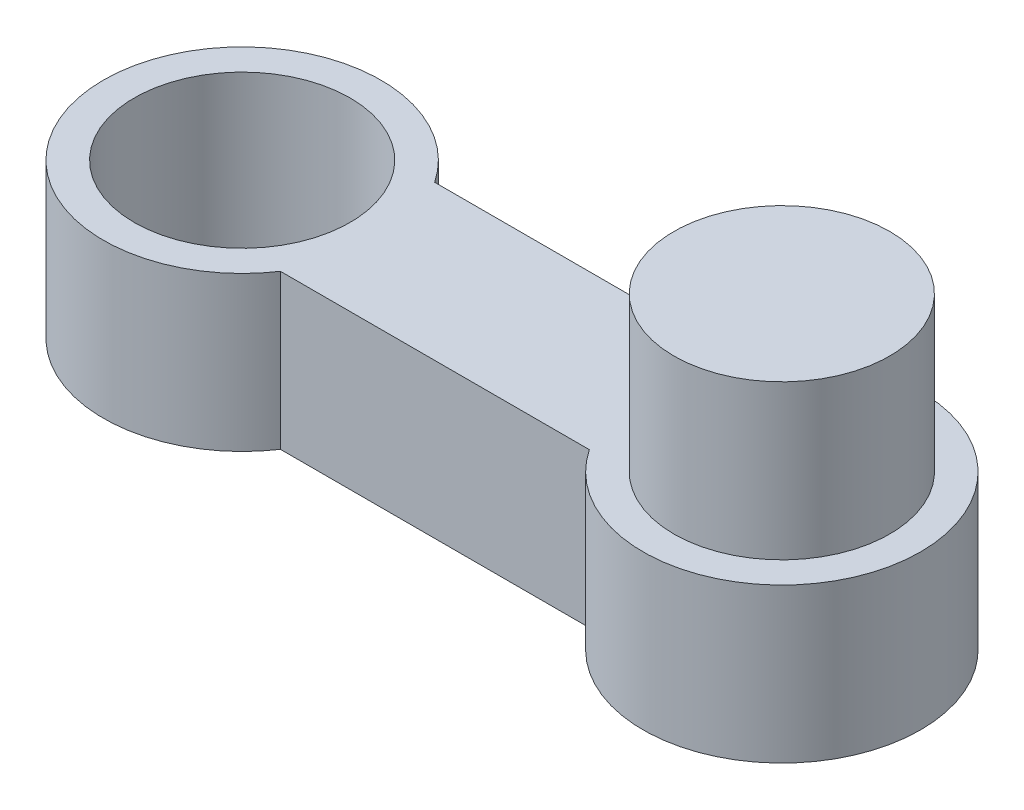
ISO-10303-21;
HEADER;
FILE_DESCRIPTION(('STEP AP214'),'2;1');
FILE_NAME('part.step','',(''),(''),'','','');
FILE_SCHEMA(('AUTOMOTIVE_DESIGN { 1 0 10303 214 1 1 1 1 }'));
ENDSEC;
DATA;
#1=APPLICATION_CONTEXT('core data for automotive mechanical design processes');
#2=APPLICATION_PROTOCOL_DEFINITION('international standard','automotive_design',2000,#1);
#3=PRODUCT_CONTEXT('',#1,'mechanical');
#4=PRODUCT('Part','Part','',(#3));
#5=PRODUCT_RELATED_PRODUCT_CATEGORY('part','',(#4));
#6=PRODUCT_DEFINITION_FORMATION('','',#4);
#7=PRODUCT_DEFINITION_CONTEXT('part definition',#1,'design');
#8=PRODUCT_DEFINITION('design','',#6,#7);
#9=PRODUCT_DEFINITION_SHAPE('','',#8);
#10=(LENGTH_UNIT() NAMED_UNIT(*) SI_UNIT(.MILLI.,.METRE.));
#11=(NAMED_UNIT(*) PLANE_ANGLE_UNIT() SI_UNIT($,.RADIAN.));
#12=(NAMED_UNIT(*) SI_UNIT($,.STERADIAN.) SOLID_ANGLE_UNIT());
#13=UNCERTAINTY_MEASURE_WITH_UNIT(LENGTH_MEASURE(1.E-05),#10,'distance_accuracy_value','');
#14=(GEOMETRIC_REPRESENTATION_CONTEXT(3) GLOBAL_UNCERTAINTY_ASSIGNED_CONTEXT((#13)) GLOBAL_UNIT_ASSIGNED_CONTEXT((#10,
#11,#12)) REPRESENTATION_CONTEXT('',''));
#15=CARTESIAN_POINT('',(0.,0.,0.));
#16=DIRECTION('',(0.,0.,1.));
#17=DIRECTION('',(1.,0.,0.));
#18=AXIS2_PLACEMENT_3D('',#15,#16,#17);
#19=CARTESIAN_POINT('',(-242.625717576026,100.,-175.992438563326));
#20=DIRECTION('',(1.,0.,-1.10744049325685E-13));
#21=DIRECTION('',(-1.10744049325685E-13,0.,-1.));
#22=AXIS2_PLACEMENT_3D('',#19,#20,#21);
#23=PLANE('',#22);
#24=DIRECTION('',(1.10744049325685E-13,0.,1.));
#25=VECTOR('',#24,1.);
#26=CARTESIAN_POINT('',(-242.625717576026,0.,-175.992438563326));
#27=LINE('',#26,#25);
#28=CARTESIAN_POINT('',(-242.625717576026,0.,-176.243066707995));
#29=VERTEX_POINT('',#28);
#30=CARTESIAN_POINT('',(-242.625717576026,0.,-175.992438563326));
#31=VERTEX_POINT('',#30);
#32=EDGE_CURVE('E139',#29,#31,#27,.T.);
#33=ORIENTED_EDGE('',*,*,#32,.T.);
#34=DIRECTION('',(0.,-1.,0.));
#35=VECTOR('',#34,1.);
#36=CARTESIAN_POINT('',(-242.625717576026,100.,-175.992438563326));
#37=LINE('',#36,#35);
#38=CARTESIAN_POINT('',(-242.625717576026,100.,-175.992438563326));
#39=VERTEX_POINT('',#38);
#40=EDGE_CURVE('E11',#39,#31,#37,.T.);
#41=ORIENTED_EDGE('',*,*,#40,.F.);
#42=DIRECTION('',(1.10744049325685E-13,0.,1.));
#43=VECTOR('',#42,1.);
#44=CARTESIAN_POINT('',(-242.625717576026,100.,-175.992438563326));
#45=LINE('',#44,#43);
#46=CARTESIAN_POINT('',(-242.625717576026,100.,-176.243066707995));
#47=VERTEX_POINT('',#46);
#48=EDGE_CURVE('E154',#47,#39,#45,.T.);
#49=ORIENTED_EDGE('',*,*,#48,.F.);
#50=DIRECTION('',(0.,-1.,0.));
#51=VECTOR('',#50,1.);
#52=CARTESIAN_POINT('',(-242.625717576026,100.,-176.243066707995));
#53=LINE('',#52,#51);
#54=EDGE_CURVE('E135',#47,#29,#53,.T.);
#55=ORIENTED_EDGE('',*,*,#54,.T.);
#56=EDGE_LOOP('',(#33,#41,#49,#55));
#57=FACE_BOUND('',#56,.T.);
#58=ADVANCED_FACE('F43',(#57),#23,.F.);
#59=CARTESIAN_POINT('',(-242.625717576026,100.,-175.992438563326));
#60=DIRECTION('',(0.,0.,-1.));
#61=DIRECTION('',(-1.,0.,0.));
#62=AXIS2_PLACEMENT_3D('',#59,#60,#61);
#63=PLANE('',#62);
#64=DIRECTION('',(1.,0.,0.));
#65=VECTOR('',#64,1.);
#66=CARTESIAN_POINT('',(-242.625717576026,0.,-175.992438563326));
#67=LINE('',#66,#65);
#68=CARTESIAN_POINT('',(-42.6257175760262,0.,-175.992438563326));
#69=VERTEX_POINT('',#68);
#70=EDGE_CURVE('E142',#31,#69,#67,.T.);
#71=ORIENTED_EDGE('',*,*,#70,.T.);
#72=DIRECTION('',(0.,-1.,0.));
#73=VECTOR('',#72,1.);
#74=CARTESIAN_POINT('',(-42.6257175760262,100.,-175.992438563326));
#75=LINE('',#74,#73);
#76=CARTESIAN_POINT('',(-42.6257175760262,100.,-175.992438563326));
#77=VERTEX_POINT('',#76);
#78=EDGE_CURVE('E51',#77,#69,#75,.T.);
#79=ORIENTED_EDGE('',*,*,#78,.F.);
#80=DIRECTION('',(1.,0.,0.));
#81=VECTOR('',#80,1.);
#82=CARTESIAN_POINT('',(-242.625717576026,100.,-175.992438563326));
#83=LINE('',#82,#81);
#84=EDGE_CURVE('E102',#39,#77,#83,.T.);
#85=ORIENTED_EDGE('',*,*,#84,.F.);
#86=ORIENTED_EDGE('',*,*,#40,.T.);
#87=EDGE_LOOP('',(#71,#79,#85,#86));
#88=FACE_BOUND('',#87,.T.);
#89=ADVANCED_FACE('F224',(#88),#63,.F.);
#90=CARTESIAN_POINT('',(-42.6257175760262,100.,-175.992438563326));
#91=DIRECTION('',(-1.,0.,0.));
#92=DIRECTION('',(0.,0.,1.));
#93=AXIS2_PLACEMENT_3D('',#90,#91,#92);
#94=PLANE('',#93);
#95=DIRECTION('',(0.,0.,-1.));
#96=VECTOR('',#95,1.);
#97=CARTESIAN_POINT('',(-42.6257175760262,0.,-175.992438563326));
#98=LINE('',#97,#96);
#99=CARTESIAN_POINT('',(-42.6257175760262,0.,-176.243066707995));
#100=VERTEX_POINT('',#99);
#101=EDGE_CURVE('E145',#69,#100,#98,.T.);
#102=ORIENTED_EDGE('',*,*,#101,.T.);
#103=DIRECTION('',(0.,-1.,0.));
#104=VECTOR('',#103,1.);
#105=CARTESIAN_POINT('',(-42.6257175760262,100.,-176.243066707995));
#106=LINE('',#105,#104);
#107=CARTESIAN_POINT('',(-42.6257175760262,100.,-176.243066707995));
#108=VERTEX_POINT('',#107);
#109=EDGE_CURVE('E161',#108,#100,#106,.T.);
#110=ORIENTED_EDGE('',*,*,#109,.F.);
#111=DIRECTION('',(0.,0.,-1.));
#112=VECTOR('',#111,1.);
#113=CARTESIAN_POINT('',(-42.6257175760262,100.,-175.992438563326));
#114=LINE('',#113,#112);
#115=EDGE_CURVE('E169',#77,#108,#114,.T.);
#116=ORIENTED_EDGE('',*,*,#115,.F.);
#117=ORIENTED_EDGE('',*,*,#78,.T.);
#118=EDGE_LOOP('',(#102,#110,#116,#117));
#119=FACE_BOUND('',#118,.T.);
#120=ADVANCED_FACE('F167',(#119),#94,.F.);
#121=CARTESIAN_POINT('',(32.3742824239738,100.,-225.992438563326));
#122=DIRECTION('',(0.,-1.,0.));
#123=DIRECTION('',(0.,0.,-1.));
#124=AXIS2_PLACEMENT_3D('',#121,#122,#123);
#125=CYLINDRICAL_SURFACE('',#124,90.);
#126=CARTESIAN_POINT('',(32.3742824239738,0.,-225.992438563326));
#127=DIRECTION('',(0.,1.,0.));
#128=DIRECTION('',(0.,0.,1.));
#129=AXIS2_PLACEMENT_3D('',#126,#127,#128);
#130=CIRCLE('',#129,90.);
#131=CARTESIAN_POINT('',(-42.6257175760262,0.,-275.741810418657));
#132=VERTEX_POINT('',#131);
#133=EDGE_CURVE('E147',#100,#132,#130,.T.);
#134=ORIENTED_EDGE('',*,*,#133,.T.);
#135=DIRECTION('',(0.,-1.,0.));
#136=VECTOR('',#135,1.);
#137=CARTESIAN_POINT('',(-42.6257175760262,100.,-275.741810418657));
#138=LINE('',#137,#136);
#139=CARTESIAN_POINT('',(-42.6257175760262,100.,-275.741810418657));
#140=VERTEX_POINT('',#139);
#141=EDGE_CURVE('E158',#140,#132,#138,.T.);
#142=ORIENTED_EDGE('',*,*,#141,.F.);
#143=CARTESIAN_POINT('',(32.3742824239738,100.,-225.992438563326));
#144=DIRECTION('',(0.,1.,0.));
#145=DIRECTION('',(0.,0.,1.));
#146=AXIS2_PLACEMENT_3D('',#143,#144,#145);
#147=CIRCLE('',#146,90.);
#148=EDGE_CURVE('E181',#108,#140,#147,.T.);
#149=ORIENTED_EDGE('',*,*,#148,.F.);
#150=ORIENTED_EDGE('',*,*,#109,.T.);
#151=EDGE_LOOP('',(#134,#142,#149,#150));
#152=FACE_BOUND('',#151,.T.);
#153=ADVANCED_FACE('F177',(#152),#125,.T.);
#154=CARTESIAN_POINT('',(-42.6257175760262,100.,-275.741810418657));
#155=DIRECTION('',(-1.,0.,0.));
#156=DIRECTION('',(0.,0.,1.));
#157=AXIS2_PLACEMENT_3D('',#154,#155,#156);
#158=PLANE('',#157);
#159=DIRECTION('',(0.,0.,-1.));
#160=VECTOR('',#159,1.);
#161=CARTESIAN_POINT('',(-42.6257175760262,0.,-275.741810418657));
#162=LINE('',#161,#160);
#163=CARTESIAN_POINT('',(-42.6257175760262,0.,-275.992438563326));
#164=VERTEX_POINT('',#163);
#165=EDGE_CURVE('E149',#132,#164,#162,.T.);
#166=ORIENTED_EDGE('',*,*,#165,.T.);
#167=DIRECTION('',(0.,-1.,0.));
#168=VECTOR('',#167,1.);
#169=CARTESIAN_POINT('',(-42.6257175760262,100.,-275.992438563326));
#170=LINE('',#169,#168);
#171=CARTESIAN_POINT('',(-42.6257175760262,100.,-275.992438563326));
#172=VERTEX_POINT('',#171);
#173=EDGE_CURVE('E130',#172,#164,#170,.T.);
#174=ORIENTED_EDGE('',*,*,#173,.F.);
#175=DIRECTION('',(0.,0.,-1.));
#176=VECTOR('',#175,1.);
#177=CARTESIAN_POINT('',(-42.6257175760262,100.,-275.741810418657));
#178=LINE('',#177,#176);
#179=EDGE_CURVE('E121',#140,#172,#178,.T.);
#180=ORIENTED_EDGE('',*,*,#179,.F.);
#181=ORIENTED_EDGE('',*,*,#141,.T.);
#182=EDGE_LOOP('',(#166,#174,#180,#181));
#183=FACE_BOUND('',#182,.T.);
#184=ADVANCED_FACE('F180',(#183),#158,.F.);
#185=CARTESIAN_POINT('',(-242.625717576026,100.,-275.992438563326));
#186=DIRECTION('',(0.,0.,1.));
#187=DIRECTION('',(1.,0.,0.));
#188=AXIS2_PLACEMENT_3D('',#185,#186,#187);
#189=PLANE('',#188);
#190=DIRECTION('',(-1.,0.,0.));
#191=VECTOR('',#190,1.);
#192=CARTESIAN_POINT('',(-242.625717576026,0.,-275.992438563326));
#193=LINE('',#192,#191);
#194=CARTESIAN_POINT('',(-242.625717576026,0.,-275.992438563326));
#195=VERTEX_POINT('',#194);
#196=EDGE_CURVE('E129',#164,#195,#193,.T.);
#197=ORIENTED_EDGE('',*,*,#196,.T.);
#198=DIRECTION('',(0.,-1.,0.));
#199=VECTOR('',#198,1.);
#200=CARTESIAN_POINT('',(-242.625717576026,100.,-275.992438563326));
#201=LINE('',#200,#199);
#202=CARTESIAN_POINT('',(-242.625717576026,100.,-275.992438563326));
#203=VERTEX_POINT('',#202);
#204=EDGE_CURVE('E126',#203,#195,#201,.T.);
#205=ORIENTED_EDGE('',*,*,#204,.F.);
#206=DIRECTION('',(-1.,0.,0.));
#207=VECTOR('',#206,1.);
#208=CARTESIAN_POINT('',(-242.625717576026,100.,-275.992438563326));
#209=LINE('',#208,#207);
#210=EDGE_CURVE('E115',#172,#203,#209,.T.);
#211=ORIENTED_EDGE('',*,*,#210,.F.);
#212=ORIENTED_EDGE('',*,*,#173,.T.);
#213=EDGE_LOOP('',(#197,#205,#211,#212));
#214=FACE_BOUND('',#213,.T.);
#215=ADVANCED_FACE('F127',(#214),#189,.F.);
#216=CARTESIAN_POINT('',(-242.625717576026,100.,-275.741810418657));
#217=DIRECTION('',(1.,0.,0.));
#218=DIRECTION('',(0.,0.,-1.));
#219=AXIS2_PLACEMENT_3D('',#216,#217,#218);
#220=PLANE('',#219);
#221=DIRECTION('',(0.,0.,1.));
#222=VECTOR('',#221,1.);
#223=CARTESIAN_POINT('',(-242.625717576026,0.,-275.741810418657));
#224=LINE('',#223,#222);
#225=CARTESIAN_POINT('',(-242.625717576026,0.,-275.741810418657));
#226=VERTEX_POINT('',#225);
#227=EDGE_CURVE('E88',#195,#226,#224,.T.);
#228=ORIENTED_EDGE('',*,*,#227,.T.);
#229=DIRECTION('',(0.,-1.,0.));
#230=VECTOR('',#229,1.);
#231=CARTESIAN_POINT('',(-242.625717576026,100.,-275.741810418657));
#232=LINE('',#231,#230);
#233=CARTESIAN_POINT('',(-242.625717576026,100.,-275.741810418657));
#234=VERTEX_POINT('',#233);
#235=EDGE_CURVE('E131',#234,#226,#232,.T.);
#236=ORIENTED_EDGE('',*,*,#235,.F.);
#237=DIRECTION('',(0.,0.,1.));
#238=VECTOR('',#237,1.);
#239=CARTESIAN_POINT('',(-242.625717576026,100.,-275.741810418657));
#240=LINE('',#239,#238);
#241=EDGE_CURVE('E119',#203,#234,#240,.T.);
#242=ORIENTED_EDGE('',*,*,#241,.F.);
#243=ORIENTED_EDGE('',*,*,#204,.T.);
#244=EDGE_LOOP('',(#228,#236,#242,#243));
#245=FACE_BOUND('',#244,.T.);
#246=ADVANCED_FACE('F133',(#245),#220,.F.);
#247=CARTESIAN_POINT('',(-317.625717576026,100.,-225.992438563326));
#248=DIRECTION('',(0.,-1.,0.));
#249=DIRECTION('',(0.,0.,-1.));
#250=AXIS2_PLACEMENT_3D('',#247,#248,#249);
#251=CYLINDRICAL_SURFACE('',#250,90.);
#252=CARTESIAN_POINT('',(-317.625717576026,0.,-225.992438563326));
#253=DIRECTION('',(0.,1.,0.));
#254=DIRECTION('',(0.,0.,1.));
#255=AXIS2_PLACEMENT_3D('',#252,#253,#254);
#256=CIRCLE('',#255,90.);
#257=EDGE_CURVE('E94',#226,#29,#256,.T.);
#258=ORIENTED_EDGE('',*,*,#257,.T.);
#259=ORIENTED_EDGE('',*,*,#54,.F.);
#260=CARTESIAN_POINT('',(-317.625717576026,100.,-225.992438563326));
#261=DIRECTION('',(0.,1.,0.));
#262=DIRECTION('',(0.,0.,1.));
#263=AXIS2_PLACEMENT_3D('',#260,#261,#262);
#264=CIRCLE('',#263,90.);
#265=EDGE_CURVE('E59',#234,#47,#264,.T.);
#266=ORIENTED_EDGE('',*,*,#265,.F.);
#267=ORIENTED_EDGE('',*,*,#235,.T.);
#268=EDGE_LOOP('',(#258,#259,#266,#267));
#269=FACE_BOUND('',#268,.T.);
#270=ADVANCED_FACE('F210',(#269),#251,.T.);
#271=CARTESIAN_POINT('',(-317.625717576026,100.,-225.992438563326));
#272=DIRECTION('',(0.,1.,0.));
#273=DIRECTION('',(0.,0.,1.));
#274=AXIS2_PLACEMENT_3D('',#271,#272,#273);
#275=PLANE('',#274);
#276=CARTESIAN_POINT('',(32.3742824239738,100.,-225.992438563326));
#277=DIRECTION('',(0.,1.,0.));
#278=DIRECTION('',(0.,0.,1.));
#279=AXIS2_PLACEMENT_3D('',#276,#277,#278);
#280=CIRCLE('',#279,70.0000000000001);
#281=CARTESIAN_POINT('',(32.3742824239738,100.,-155.992438563326));
#282=VERTEX_POINT('',#281);
#283=EDGE_CURVE('E193',#282,#282,#280,.T.);
#284=ORIENTED_EDGE('',*,*,#283,.F.);
#285=EDGE_LOOP('',(#284));
#286=FACE_BOUND('',#285,.T.);
#287=CARTESIAN_POINT('',(-317.625717576026,100.,-225.992438563326));
#288=DIRECTION('',(0.,1.,0.));
#289=DIRECTION('',(0.,0.,1.));
#290=AXIS2_PLACEMENT_3D('',#287,#288,#289);
#291=CIRCLE('',#290,70.);
#292=CARTESIAN_POINT('',(-317.625717576026,100.,-155.992438563326));
#293=VERTEX_POINT('',#292);
#294=EDGE_CURVE('E187',#293,#293,#291,.T.);
#295=ORIENTED_EDGE('',*,*,#294,.F.);
#296=EDGE_LOOP('',(#295));
#297=FACE_BOUND('',#296,.T.);
#298=ORIENTED_EDGE('',*,*,#48,.T.);
#299=ORIENTED_EDGE('',*,*,#84,.T.);
#300=ORIENTED_EDGE('',*,*,#115,.T.);
#301=ORIENTED_EDGE('',*,*,#148,.T.);
#302=ORIENTED_EDGE('',*,*,#179,.T.);
#303=ORIENTED_EDGE('',*,*,#210,.T.);
#304=ORIENTED_EDGE('',*,*,#241,.T.);
#305=ORIENTED_EDGE('',*,*,#265,.T.);
#306=EDGE_LOOP('',(#298,#299,#300,#301,#302,#303,#304,#305));
#307=FACE_BOUND('',#306,.T.);
#308=ADVANCED_FACE('F117',(#286,#297,#307),#275,.T.);
#309=CARTESIAN_POINT('',(-317.625717576026,0.,-225.992438563326));
#310=DIRECTION('',(0.,1.,0.));
#311=DIRECTION('',(0.,0.,1.));
#312=AXIS2_PLACEMENT_3D('',#309,#310,#311);
#313=PLANE('',#312);
#314=CARTESIAN_POINT('',(-317.625717576026,0.,-225.992438563326));
#315=DIRECTION('',(0.,1.,0.));
#316=DIRECTION('',(0.,0.,1.));
#317=AXIS2_PLACEMENT_3D('',#314,#315,#316);
#318=CIRCLE('',#317,70.);
#319=CARTESIAN_POINT('',(-317.625717576026,0.,-155.992438563326));
#320=VERTEX_POINT('',#319);
#321=EDGE_CURVE('E143',#320,#320,#318,.T.);
#322=ORIENTED_EDGE('',*,*,#321,.T.);
#323=EDGE_LOOP('',(#322));
#324=FACE_BOUND('',#323,.T.);
#325=ORIENTED_EDGE('',*,*,#32,.F.);
#326=ORIENTED_EDGE('',*,*,#257,.F.);
#327=ORIENTED_EDGE('',*,*,#227,.F.);
#328=ORIENTED_EDGE('',*,*,#196,.F.);
#329=ORIENTED_EDGE('',*,*,#165,.F.);
#330=ORIENTED_EDGE('',*,*,#133,.F.);
#331=ORIENTED_EDGE('',*,*,#101,.F.);
#332=ORIENTED_EDGE('',*,*,#70,.F.);
#333=EDGE_LOOP('',(#325,#326,#327,#328,#329,#330,#331,#332));
#334=FACE_BOUND('',#333,.T.);
#335=ADVANCED_FACE('F173',(#324,#334),#313,.F.);
#336=CARTESIAN_POINT('',(-317.625717576026,0.,-225.992438563326));
#337=DIRECTION('',(0.,1.,0.));
#338=DIRECTION('',(0.,0.,1.));
#339=AXIS2_PLACEMENT_3D('',#336,#337,#338);
#340=CYLINDRICAL_SURFACE('',#339,70.);
#341=ORIENTED_EDGE('',*,*,#321,.F.);
#342=EDGE_LOOP('',(#341));
#343=FACE_BOUND('',#342,.T.);
#344=ORIENTED_EDGE('',*,*,#294,.T.);
#345=EDGE_LOOP('',(#344));
#346=FACE_BOUND('',#345,.T.);
#347=ADVANCED_FACE('F204',(#343,#346),#340,.F.);
#348=CARTESIAN_POINT('',(32.3742824239738,200.,-225.992438563326));
#349=DIRECTION('',(0.,-1.,0.));
#350=DIRECTION('',(0.,0.,-1.));
#351=AXIS2_PLACEMENT_3D('',#348,#349,#350);
#352=CYLINDRICAL_SURFACE('',#351,70.0000000000001);
#353=CARTESIAN_POINT('',(32.3742824239738,200.,-225.992438563326));
#354=DIRECTION('',(0.,1.,0.));
#355=DIRECTION('',(0.,0.,1.));
#356=AXIS2_PLACEMENT_3D('',#353,#354,#355);
#357=CIRCLE('',#356,70.0000000000001);
#358=CARTESIAN_POINT('',(32.3742824239738,200.,-155.992438563326));
#359=VERTEX_POINT('',#358);
#360=EDGE_CURVE('E190',#359,#359,#357,.T.);
#361=ORIENTED_EDGE('',*,*,#360,.F.);
#362=EDGE_LOOP('',(#361));
#363=FACE_BOUND('',#362,.T.);
#364=ORIENTED_EDGE('',*,*,#283,.T.);
#365=EDGE_LOOP('',(#364));
#366=FACE_BOUND('',#365,.T.);
#367=ADVANCED_FACE('F201',(#363,#366),#352,.T.);
#368=CARTESIAN_POINT('',(32.3742824239738,200.,-225.992438563326));
#369=DIRECTION('',(0.,1.,0.));
#370=DIRECTION('',(0.,0.,1.));
#371=AXIS2_PLACEMENT_3D('',#368,#369,#370);
#372=PLANE('',#371);
#373=ORIENTED_EDGE('',*,*,#360,.T.);
#374=EDGE_LOOP('',(#373));
#375=FACE_BOUND('',#374,.T.);
#376=ADVANCED_FACE('F199',(#375),#372,.T.);
#377=CLOSED_SHELL('',(#58,#89,#120,#153,#184,#215,#246,#270,#308,#335,#347,#367,#376));
#378=MANIFOLD_SOLID_BREP('B2',#377);
#379=ADVANCED_BREP_SHAPE_REPRESENTATION('',(#18,#378),#14);
#380=SHAPE_DEFINITION_REPRESENTATION(#9,#379);
ENDSEC;
END-ISO-10303-21;
